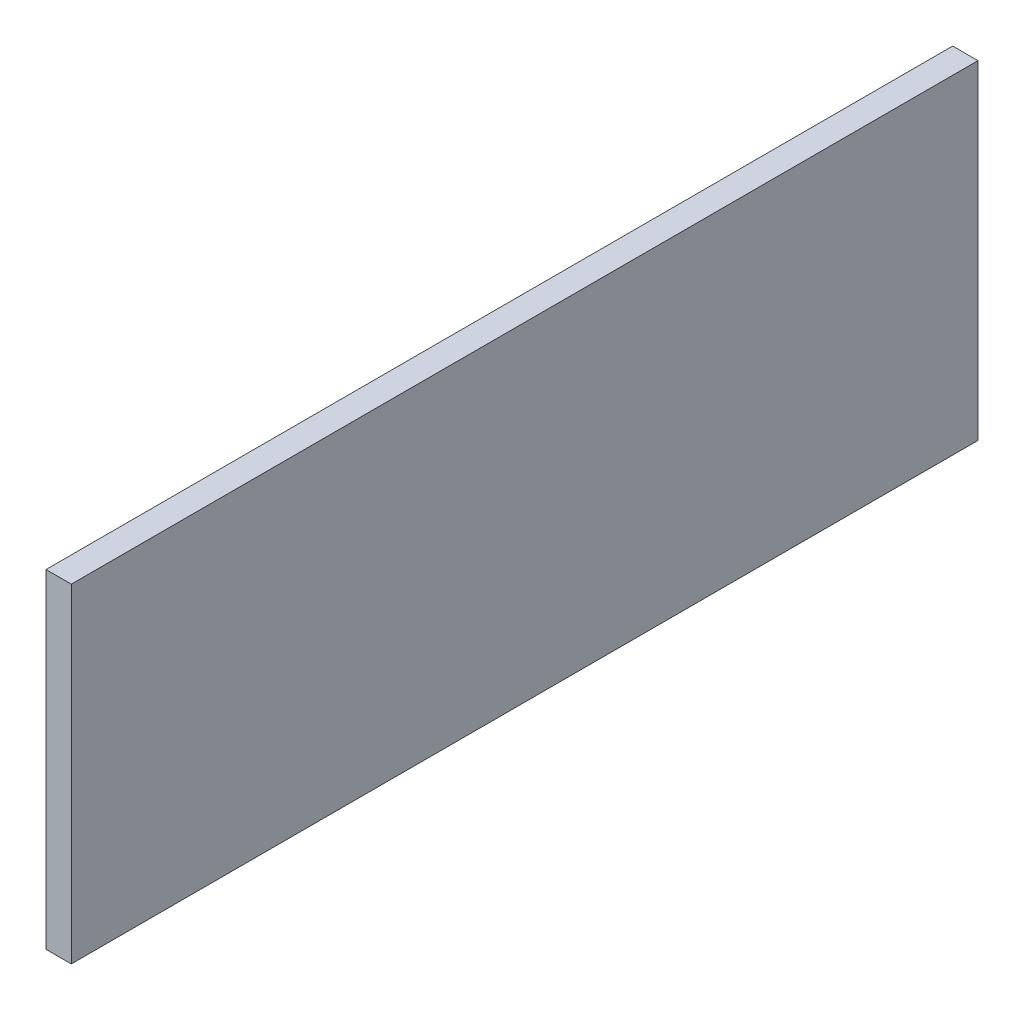
ISO-10303-21;
HEADER;
FILE_DESCRIPTION(('STEP AP214'),'2;1');
FILE_NAME('part.step','',(''),(''),'','','');
FILE_SCHEMA(('AUTOMOTIVE_DESIGN { 1 0 10303 214 1 1 1 1 }'));
ENDSEC;
DATA;
#1=APPLICATION_CONTEXT('core data for automotive mechanical design processes');
#2=APPLICATION_PROTOCOL_DEFINITION('international standard','automotive_design',2000,#1);
#3=PRODUCT_CONTEXT('',#1,'mechanical');
#4=PRODUCT('Part','Part','',(#3));
#5=PRODUCT_RELATED_PRODUCT_CATEGORY('part','',(#4));
#6=PRODUCT_DEFINITION_FORMATION('','',#4);
#7=PRODUCT_DEFINITION_CONTEXT('part definition',#1,'design');
#8=PRODUCT_DEFINITION('design','',#6,#7);
#9=PRODUCT_DEFINITION_SHAPE('','',#8);
#10=(LENGTH_UNIT() NAMED_UNIT(*) SI_UNIT(.MILLI.,.METRE.));
#11=(NAMED_UNIT(*) PLANE_ANGLE_UNIT() SI_UNIT($,.RADIAN.));
#12=(NAMED_UNIT(*) SI_UNIT($,.STERADIAN.) SOLID_ANGLE_UNIT());
#13=UNCERTAINTY_MEASURE_WITH_UNIT(LENGTH_MEASURE(1.E-05),#10,'distance_accuracy_value','');
#14=(GEOMETRIC_REPRESENTATION_CONTEXT(3) GLOBAL_UNCERTAINTY_ASSIGNED_CONTEXT((#13)) GLOBAL_UNIT_ASSIGNED_CONTEXT((#10,
#11,#12)) REPRESENTATION_CONTEXT('',''));
#15=CARTESIAN_POINT('',(0.,0.,0.));
#16=DIRECTION('',(0.,0.,1.));
#17=DIRECTION('',(1.,0.,0.));
#18=AXIS2_PLACEMENT_3D('',#15,#16,#17);
#19=CARTESIAN_POINT('',(6.,39.3049356349038,63.7989235994149));
#20=DIRECTION('',(0.,0.,-1.));
#21=DIRECTION('',(0.,1.,0.));
#22=AXIS2_PLACEMENT_3D('',#19,#20,#21);
#23=PLANE('',#22);
#24=DIRECTION('',(0.,-1.,0.));
#25=VECTOR('',#24,1.);
#26=CARTESIAN_POINT('',(0.,39.3049356349038,63.7989235994149));
#27=LINE('',#26,#25);
#28=CARTESIAN_POINT('',(0.,39.3049356349038,63.7989235994149));
#29=VERTEX_POINT('',#28);
#30=CARTESIAN_POINT('',(0.,-38.6950643650962,63.7989235994149));
#31=VERTEX_POINT('',#30);
#32=EDGE_CURVE('E96',#29,#31,#27,.T.);
#33=ORIENTED_EDGE('',*,*,#32,.T.);
#34=DIRECTION('',(-1.,0.,0.));
#35=VECTOR('',#34,1.);
#36=CARTESIAN_POINT('',(6.,-38.6950643650962,63.7989235994149));
#37=LINE('',#36,#35);
#38=CARTESIAN_POINT('',(6.,-38.6950643650962,63.7989235994149));
#39=VERTEX_POINT('',#38);
#40=EDGE_CURVE('E11',#39,#31,#37,.T.);
#41=ORIENTED_EDGE('',*,*,#40,.F.);
#42=DIRECTION('',(0.,-1.,0.));
#43=VECTOR('',#42,1.);
#44=CARTESIAN_POINT('',(6.,39.3049356349038,63.7989235994149));
#45=LINE('',#44,#43);
#46=CARTESIAN_POINT('',(6.,39.3049356349038,63.7989235994149));
#47=VERTEX_POINT('',#46);
#48=EDGE_CURVE('E84',#47,#39,#45,.T.);
#49=ORIENTED_EDGE('',*,*,#48,.F.);
#50=DIRECTION('',(-1.,0.,0.));
#51=VECTOR('',#50,1.);
#52=CARTESIAN_POINT('',(6.,39.3049356349038,63.7989235994149));
#53=LINE('',#52,#51);
#54=EDGE_CURVE('E92',#47,#29,#53,.T.);
#55=ORIENTED_EDGE('',*,*,#54,.T.);
#56=EDGE_LOOP('',(#33,#41,#49,#55));
#57=FACE_BOUND('',#56,.T.);
#58=ADVANCED_FACE('F33',(#57),#23,.F.);
#59=CARTESIAN_POINT('',(6.,-38.6950643650962,63.7989235994149));
#60=DIRECTION('',(0.,1.,0.));
#61=DIRECTION('',(0.,0.,1.));
#62=AXIS2_PLACEMENT_3D('',#59,#60,#61);
#63=PLANE('',#62);
#64=DIRECTION('',(0.,0.,-1.));
#65=VECTOR('',#64,1.);
#66=CARTESIAN_POINT('',(0.,-38.6950643650962,63.7989235994149));
#67=LINE('',#66,#65);
#68=CARTESIAN_POINT('',(0.,-38.6950643650962,-151.201076400585));
#69=VERTEX_POINT('',#68);
#70=EDGE_CURVE('E88',#31,#69,#67,.T.);
#71=ORIENTED_EDGE('',*,*,#70,.T.);
#72=DIRECTION('',(-1.,0.,0.));
#73=VECTOR('',#72,1.);
#74=CARTESIAN_POINT('',(6.,-38.6950643650962,-151.201076400585));
#75=LINE('',#74,#73);
#76=CARTESIAN_POINT('',(6.,-38.6950643650962,-151.201076400585));
#77=VERTEX_POINT('',#76);
#78=EDGE_CURVE('E41',#77,#69,#75,.T.);
#79=ORIENTED_EDGE('',*,*,#78,.F.);
#80=DIRECTION('',(0.,0.,-1.));
#81=VECTOR('',#80,1.);
#82=CARTESIAN_POINT('',(6.,-38.6950643650962,63.7989235994149));
#83=LINE('',#82,#81);
#84=EDGE_CURVE('E79',#39,#77,#83,.T.);
#85=ORIENTED_EDGE('',*,*,#84,.F.);
#86=ORIENTED_EDGE('',*,*,#40,.T.);
#87=EDGE_LOOP('',(#71,#79,#85,#86));
#88=FACE_BOUND('',#87,.T.);
#89=ADVANCED_FACE('F87',(#88),#63,.F.);
#90=CARTESIAN_POINT('',(6.,39.3049356349038,-151.201076400585));
#91=DIRECTION('',(0.,0.,1.));
#92=DIRECTION('',(0.,-1.,0.));
#93=AXIS2_PLACEMENT_3D('',#90,#91,#92);
#94=PLANE('',#93);
#95=DIRECTION('',(0.,1.,0.));
#96=VECTOR('',#95,1.);
#97=CARTESIAN_POINT('',(0.,39.3049356349038,-151.201076400585));
#98=LINE('',#97,#96);
#99=CARTESIAN_POINT('',(0.,39.3049356349038,-151.201076400585));
#100=VERTEX_POINT('',#99);
#101=EDGE_CURVE('E66',#69,#100,#98,.T.);
#102=ORIENTED_EDGE('',*,*,#101,.T.);
#103=DIRECTION('',(-1.,0.,0.));
#104=VECTOR('',#103,1.);
#105=CARTESIAN_POINT('',(6.,39.3049356349038,-151.201076400585));
#106=LINE('',#105,#104);
#107=CARTESIAN_POINT('',(6.,39.3049356349038,-151.201076400585));
#108=VERTEX_POINT('',#107);
#109=EDGE_CURVE('E89',#108,#100,#106,.T.);
#110=ORIENTED_EDGE('',*,*,#109,.F.);
#111=DIRECTION('',(0.,1.,0.));
#112=VECTOR('',#111,1.);
#113=CARTESIAN_POINT('',(6.,39.3049356349038,-151.201076400585));
#114=LINE('',#113,#112);
#115=EDGE_CURVE('E82',#77,#108,#114,.T.);
#116=ORIENTED_EDGE('',*,*,#115,.F.);
#117=ORIENTED_EDGE('',*,*,#78,.T.);
#118=EDGE_LOOP('',(#102,#110,#116,#117));
#119=FACE_BOUND('',#118,.T.);
#120=ADVANCED_FACE('F90',(#119),#94,.F.);
#121=CARTESIAN_POINT('',(6.,39.3049356349038,63.7989235994149));
#122=DIRECTION('',(0.,-1.,0.));
#123=DIRECTION('',(0.,0.,-1.));
#124=AXIS2_PLACEMENT_3D('',#121,#122,#123);
#125=PLANE('',#124);
#126=DIRECTION('',(0.,0.,1.));
#127=VECTOR('',#126,1.);
#128=CARTESIAN_POINT('',(0.,39.3049356349038,63.7989235994149));
#129=LINE('',#128,#127);
#130=EDGE_CURVE('E72',#100,#29,#129,.T.);
#131=ORIENTED_EDGE('',*,*,#130,.T.);
#132=ORIENTED_EDGE('',*,*,#54,.F.);
#133=DIRECTION('',(0.,0.,1.));
#134=VECTOR('',#133,1.);
#135=CARTESIAN_POINT('',(6.,39.3049356349038,63.7989235994149));
#136=LINE('',#135,#134);
#137=EDGE_CURVE('E49',#108,#47,#136,.T.);
#138=ORIENTED_EDGE('',*,*,#137,.F.);
#139=ORIENTED_EDGE('',*,*,#109,.T.);
#140=EDGE_LOOP('',(#131,#132,#138,#139));
#141=FACE_BOUND('',#140,.T.);
#142=ADVANCED_FACE('F103',(#141),#125,.F.);
#143=CARTESIAN_POINT('',(6.,0.,0.));
#144=DIRECTION('',(1.,0.,0.));
#145=DIRECTION('',(0.,0.,-1.));
#146=AXIS2_PLACEMENT_3D('',#143,#144,#145);
#147=PLANE('',#146);
#148=ORIENTED_EDGE('',*,*,#48,.T.);
#149=ORIENTED_EDGE('',*,*,#84,.T.);
#150=ORIENTED_EDGE('',*,*,#115,.T.);
#151=ORIENTED_EDGE('',*,*,#137,.T.);
#152=EDGE_LOOP('',(#148,#149,#150,#151));
#153=FACE_BOUND('',#152,.T.);
#154=ADVANCED_FACE('F80',(#153),#147,.T.);
#155=CARTESIAN_POINT('',(0.,0.,0.));
#156=DIRECTION('',(1.,0.,0.));
#157=DIRECTION('',(0.,0.,-1.));
#158=AXIS2_PLACEMENT_3D('',#155,#156,#157);
#159=PLANE('',#158);
#160=ORIENTED_EDGE('',*,*,#32,.F.);
#161=ORIENTED_EDGE('',*,*,#130,.F.);
#162=ORIENTED_EDGE('',*,*,#101,.F.);
#163=ORIENTED_EDGE('',*,*,#70,.F.);
#164=EDGE_LOOP('',(#160,#161,#162,#163));
#165=FACE_BOUND('',#164,.T.);
#166=ADVANCED_FACE('F106',(#165),#159,.F.);
#167=CLOSED_SHELL('',(#58,#89,#120,#142,#154,#166));
#168=MANIFOLD_SOLID_BREP('B2',#167);
#169=ADVANCED_BREP_SHAPE_REPRESENTATION('',(#18,#168),#14);
#170=SHAPE_DEFINITION_REPRESENTATION(#9,#169);
ENDSEC;
END-ISO-10303-21;
